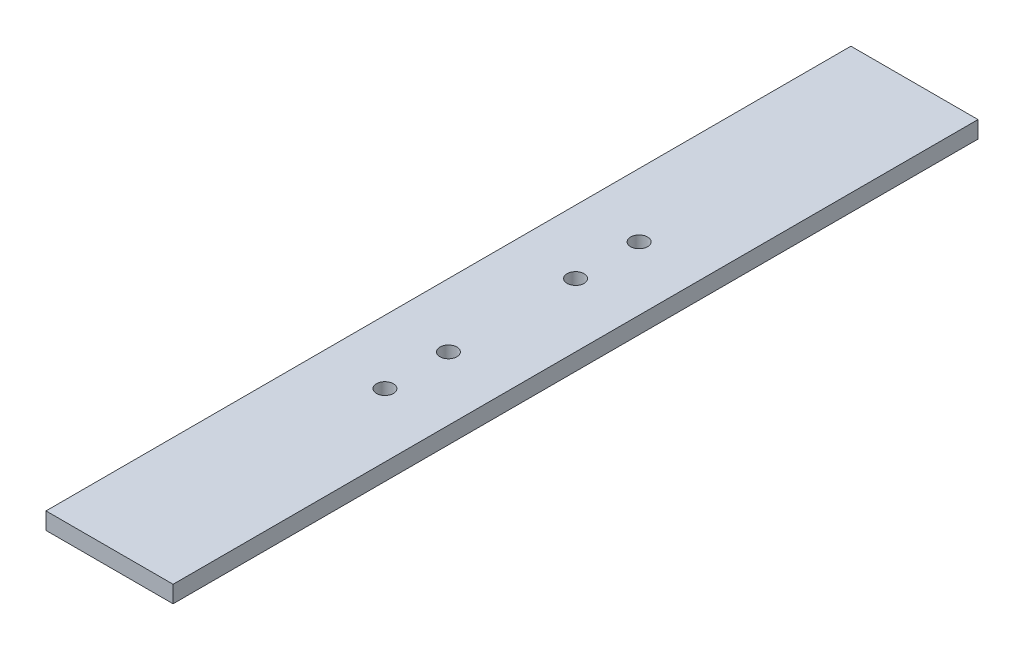
ISO-10303-21;
HEADER;
FILE_DESCRIPTION(('STEP AP214'),'2;1');
FILE_NAME('part.step','',(''),(''),'','','');
FILE_SCHEMA(('AUTOMOTIVE_DESIGN { 1 0 10303 214 1 1 1 1 }'));
ENDSEC;
DATA;
#1=APPLICATION_CONTEXT('core data for automotive mechanical design processes');
#2=APPLICATION_PROTOCOL_DEFINITION('international standard','automotive_design',2000,#1);
#3=PRODUCT_CONTEXT('',#1,'mechanical');
#4=PRODUCT('Part','Part','',(#3));
#5=PRODUCT_RELATED_PRODUCT_CATEGORY('part','',(#4));
#6=PRODUCT_DEFINITION_FORMATION('','',#4);
#7=PRODUCT_DEFINITION_CONTEXT('part definition',#1,'design');
#8=PRODUCT_DEFINITION('design','',#6,#7);
#9=PRODUCT_DEFINITION_SHAPE('','',#8);
#10=(LENGTH_UNIT() NAMED_UNIT(*) SI_UNIT(.MILLI.,.METRE.));
#11=(NAMED_UNIT(*) PLANE_ANGLE_UNIT() SI_UNIT($,.RADIAN.));
#12=(NAMED_UNIT(*) SI_UNIT($,.STERADIAN.) SOLID_ANGLE_UNIT());
#13=UNCERTAINTY_MEASURE_WITH_UNIT(LENGTH_MEASURE(1.E-05),#10,'distance_accuracy_value','');
#14=(GEOMETRIC_REPRESENTATION_CONTEXT(3) GLOBAL_UNCERTAINTY_ASSIGNED_CONTEXT((#13)) GLOBAL_UNIT_ASSIGNED_CONTEXT((#10,
#11,#12)) REPRESENTATION_CONTEXT('',''));
#15=CARTESIAN_POINT('',(0.,0.,0.));
#16=DIRECTION('',(0.,0.,1.));
#17=DIRECTION('',(1.,0.,0.));
#18=AXIS2_PLACEMENT_3D('',#15,#16,#17);
#19=CARTESIAN_POINT('',(0.,2.,0.));
#20=DIRECTION('',(0.,1.,0.));
#21=DIRECTION('',(0.,0.,1.));
#22=AXIS2_PLACEMENT_3D('',#19,#20,#21);
#23=PLANE('',#22);
#24=CARTESIAN_POINT('',(-57.5,2.,15.));
#25=DIRECTION('',(0.,1.,0.));
#26=DIRECTION('',(0.,0.,1.));
#27=AXIS2_PLACEMENT_3D('',#24,#25,#26);
#28=CIRCLE('',#27,0.999999999999998);
#29=CARTESIAN_POINT('',(-57.5,2.,16.));
#30=VERTEX_POINT('',#29);
#31=EDGE_CURVE('E142',#30,#30,#28,.T.);
#32=ORIENTED_EDGE('',*,*,#31,.F.);
#33=EDGE_LOOP('',(#32));
#34=FACE_BOUND('',#33,.T.);
#35=CARTESIAN_POINT('',(-57.5,2.,-15.));
#36=DIRECTION('',(0.,1.,0.));
#37=DIRECTION('',(0.,0.,1.));
#38=AXIS2_PLACEMENT_3D('',#35,#36,#37);
#39=CIRCLE('',#38,0.999999999999998);
#40=CARTESIAN_POINT('',(-57.5,2.,-14.));
#41=VERTEX_POINT('',#40);
#42=EDGE_CURVE('E112',#41,#41,#39,.T.);
#43=ORIENTED_EDGE('',*,*,#42,.F.);
#44=EDGE_LOOP('',(#43));
#45=FACE_BOUND('',#44,.T.);
#46=DIRECTION('',(0.,0.,1.));
#47=VECTOR('',#46,1.);
#48=CARTESIAN_POINT('',(-65.,2.,-47.5));
#49=LINE('',#48,#47);
#50=CARTESIAN_POINT('',(-65.,2.,-47.5));
#51=VERTEX_POINT('',#50);
#52=CARTESIAN_POINT('',(-65.,2.,47.5));
#53=VERTEX_POINT('',#52);
#54=EDGE_CURVE('E92',#51,#53,#49,.T.);
#55=ORIENTED_EDGE('',*,*,#54,.T.);
#56=DIRECTION('',(1.,0.,0.));
#57=VECTOR('',#56,1.);
#58=CARTESIAN_POINT('',(-65.,2.,47.5));
#59=LINE('',#58,#57);
#60=CARTESIAN_POINT('',(-50.,2.,47.5));
#61=VERTEX_POINT('',#60);
#62=EDGE_CURVE('E87',#53,#61,#59,.T.);
#63=ORIENTED_EDGE('',*,*,#62,.T.);
#64=DIRECTION('',(0.,0.,-1.));
#65=VECTOR('',#64,1.);
#66=CARTESIAN_POINT('',(-50.,2.,-47.5));
#67=LINE('',#66,#65);
#68=CARTESIAN_POINT('',(-50.,2.,-47.5));
#69=VERTEX_POINT('',#68);
#70=EDGE_CURVE('E90',#61,#69,#67,.T.);
#71=ORIENTED_EDGE('',*,*,#70,.T.);
#72=DIRECTION('',(-1.,0.,0.));
#73=VECTOR('',#72,1.);
#74=CARTESIAN_POINT('',(-65.,2.,-47.5));
#75=LINE('',#74,#73);
#76=EDGE_CURVE('E57',#69,#51,#75,.T.);
#77=ORIENTED_EDGE('',*,*,#76,.T.);
#78=EDGE_LOOP('',(#55,#63,#71,#77));
#79=FACE_BOUND('',#78,.T.);
#80=CARTESIAN_POINT('',(-57.5,2.,7.5));
#81=DIRECTION('',(0.,1.,0.));
#82=DIRECTION('',(0.,0.,1.));
#83=AXIS2_PLACEMENT_3D('',#80,#81,#82);
#84=CIRCLE('',#83,0.999999999999998);
#85=CARTESIAN_POINT('',(-57.5,2.,8.5));
#86=VERTEX_POINT('',#85);
#87=EDGE_CURVE('E134',#86,#86,#84,.T.);
#88=ORIENTED_EDGE('',*,*,#87,.F.);
#89=EDGE_LOOP('',(#88));
#90=FACE_BOUND('',#89,.T.);
#91=CARTESIAN_POINT('',(-57.5,2.,-7.5));
#92=DIRECTION('',(0.,1.,0.));
#93=DIRECTION('',(0.,0.,1.));
#94=AXIS2_PLACEMENT_3D('',#91,#92,#93);
#95=CIRCLE('',#94,0.999999999999998);
#96=CARTESIAN_POINT('',(-57.5,2.,-6.5));
#97=VERTEX_POINT('',#96);
#98=EDGE_CURVE('E150',#97,#97,#95,.T.);
#99=ORIENTED_EDGE('',*,*,#98,.F.);
#100=EDGE_LOOP('',(#99));
#101=FACE_BOUND('',#100,.T.);
#102=ADVANCED_FACE('F39',(#34,#45,#79,#90,#101),#23,.T.);
#103=CARTESIAN_POINT('',(0.,0.,0.));
#104=DIRECTION('',(0.,1.,0.));
#105=DIRECTION('',(0.,0.,1.));
#106=AXIS2_PLACEMENT_3D('',#103,#104,#105);
#107=PLANE('',#106);
#108=DIRECTION('',(0.,0.,1.));
#109=VECTOR('',#108,1.);
#110=CARTESIAN_POINT('',(-65.,0.,-47.5));
#111=LINE('',#110,#109);
#112=CARTESIAN_POINT('',(-65.,0.,-47.5));
#113=VERTEX_POINT('',#112);
#114=CARTESIAN_POINT('',(-65.,0.,47.5));
#115=VERTEX_POINT('',#114);
#116=EDGE_CURVE('E108',#113,#115,#111,.T.);
#117=ORIENTED_EDGE('',*,*,#116,.F.);
#118=DIRECTION('',(-1.,0.,0.));
#119=VECTOR('',#118,1.);
#120=CARTESIAN_POINT('',(-65.,0.,-47.5));
#121=LINE('',#120,#119);
#122=CARTESIAN_POINT('',(-50.,0.,-47.5));
#123=VERTEX_POINT('',#122);
#124=EDGE_CURVE('E80',#123,#113,#121,.T.);
#125=ORIENTED_EDGE('',*,*,#124,.F.);
#126=DIRECTION('',(0.,0.,-1.));
#127=VECTOR('',#126,1.);
#128=CARTESIAN_POINT('',(-50.,0.,-47.5));
#129=LINE('',#128,#127);
#130=CARTESIAN_POINT('',(-50.,0.,47.5));
#131=VERTEX_POINT('',#130);
#132=EDGE_CURVE('E74',#131,#123,#129,.T.);
#133=ORIENTED_EDGE('',*,*,#132,.F.);
#134=DIRECTION('',(1.,0.,0.));
#135=VECTOR('',#134,1.);
#136=CARTESIAN_POINT('',(-65.,0.,47.5));
#137=LINE('',#136,#135);
#138=EDGE_CURVE('E97',#115,#131,#137,.T.);
#139=ORIENTED_EDGE('',*,*,#138,.F.);
#140=EDGE_LOOP('',(#117,#125,#133,#139));
#141=FACE_BOUND('',#140,.T.);
#142=CARTESIAN_POINT('',(-57.5,0.,-15.));
#143=DIRECTION('',(0.,1.,0.));
#144=DIRECTION('',(0.,0.,1.));
#145=AXIS2_PLACEMENT_3D('',#142,#143,#144);
#146=CIRCLE('',#145,0.999999999999998);
#147=CARTESIAN_POINT('',(-57.5,0.,-14.));
#148=VERTEX_POINT('',#147);
#149=EDGE_CURVE('E130',#148,#148,#146,.T.);
#150=ORIENTED_EDGE('',*,*,#149,.T.);
#151=EDGE_LOOP('',(#150));
#152=FACE_BOUND('',#151,.T.);
#153=CARTESIAN_POINT('',(-57.5,0.,7.5));
#154=DIRECTION('',(0.,1.,0.));
#155=DIRECTION('',(0.,0.,1.));
#156=AXIS2_PLACEMENT_3D('',#153,#154,#155);
#157=CIRCLE('',#156,0.999999999999998);
#158=CARTESIAN_POINT('',(-57.5,0.,8.5));
#159=VERTEX_POINT('',#158);
#160=EDGE_CURVE('E138',#159,#159,#157,.T.);
#161=ORIENTED_EDGE('',*,*,#160,.T.);
#162=EDGE_LOOP('',(#161));
#163=FACE_BOUND('',#162,.T.);
#164=CARTESIAN_POINT('',(-57.5,0.,15.));
#165=DIRECTION('',(0.,1.,0.));
#166=DIRECTION('',(0.,0.,1.));
#167=AXIS2_PLACEMENT_3D('',#164,#165,#166);
#168=CIRCLE('',#167,0.999999999999998);
#169=CARTESIAN_POINT('',(-57.5,0.,16.));
#170=VERTEX_POINT('',#169);
#171=EDGE_CURVE('E146',#170,#170,#168,.T.);
#172=ORIENTED_EDGE('',*,*,#171,.T.);
#173=EDGE_LOOP('',(#172));
#174=FACE_BOUND('',#173,.T.);
#175=CARTESIAN_POINT('',(-57.5,0.,-7.5));
#176=DIRECTION('',(0.,1.,0.));
#177=DIRECTION('',(0.,0.,1.));
#178=AXIS2_PLACEMENT_3D('',#175,#176,#177);
#179=CIRCLE('',#178,0.999999999999998);
#180=CARTESIAN_POINT('',(-57.5,0.,-6.5));
#181=VERTEX_POINT('',#180);
#182=EDGE_CURVE('E154',#181,#181,#179,.T.);
#183=ORIENTED_EDGE('',*,*,#182,.T.);
#184=EDGE_LOOP('',(#183));
#185=FACE_BOUND('',#184,.T.);
#186=ADVANCED_FACE('F125',(#141,#152,#163,#174,#185),#107,.F.);
#187=CARTESIAN_POINT('',(-65.,2.,-47.5));
#188=DIRECTION('',(1.,0.,0.));
#189=DIRECTION('',(0.,0.,-1.));
#190=AXIS2_PLACEMENT_3D('',#187,#188,#189);
#191=PLANE('',#190);
#192=ORIENTED_EDGE('',*,*,#116,.T.);
#193=DIRECTION('',(0.,-1.,0.));
#194=VECTOR('',#193,1.);
#195=CARTESIAN_POINT('',(-65.,2.,47.5));
#196=LINE('',#195,#194);
#197=EDGE_CURVE('E11',#53,#115,#196,.T.);
#198=ORIENTED_EDGE('',*,*,#197,.F.);
#199=ORIENTED_EDGE('',*,*,#54,.F.);
#200=DIRECTION('',(0.,-1.,0.));
#201=VECTOR('',#200,1.);
#202=CARTESIAN_POINT('',(-65.,2.,-47.5));
#203=LINE('',#202,#201);
#204=EDGE_CURVE('E104',#51,#113,#203,.T.);
#205=ORIENTED_EDGE('',*,*,#204,.T.);
#206=EDGE_LOOP('',(#192,#198,#199,#205));
#207=FACE_BOUND('',#206,.T.);
#208=ADVANCED_FACE('F41',(#207),#191,.F.);
#209=CARTESIAN_POINT('',(-65.,2.,47.5));
#210=DIRECTION('',(0.,0.,-1.));
#211=DIRECTION('',(-1.,0.,0.));
#212=AXIS2_PLACEMENT_3D('',#209,#210,#211);
#213=PLANE('',#212);
#214=ORIENTED_EDGE('',*,*,#138,.T.);
#215=DIRECTION('',(0.,-1.,0.));
#216=VECTOR('',#215,1.);
#217=CARTESIAN_POINT('',(-50.,2.,47.5));
#218=LINE('',#217,#216);
#219=EDGE_CURVE('E49',#61,#131,#218,.T.);
#220=ORIENTED_EDGE('',*,*,#219,.F.);
#221=ORIENTED_EDGE('',*,*,#62,.F.);
#222=ORIENTED_EDGE('',*,*,#197,.T.);
#223=EDGE_LOOP('',(#214,#220,#221,#222));
#224=FACE_BOUND('',#223,.T.);
#225=ADVANCED_FACE('F96',(#224),#213,.F.);
#226=CARTESIAN_POINT('',(-50.,2.,-47.5));
#227=DIRECTION('',(-1.,0.,0.));
#228=DIRECTION('',(0.,0.,1.));
#229=AXIS2_PLACEMENT_3D('',#226,#227,#228);
#230=PLANE('',#229);
#231=ORIENTED_EDGE('',*,*,#132,.T.);
#232=DIRECTION('',(0.,-1.,0.));
#233=VECTOR('',#232,1.);
#234=CARTESIAN_POINT('',(-50.,2.,-47.5));
#235=LINE('',#234,#233);
#236=EDGE_CURVE('E99',#69,#123,#235,.T.);
#237=ORIENTED_EDGE('',*,*,#236,.F.);
#238=ORIENTED_EDGE('',*,*,#70,.F.);
#239=ORIENTED_EDGE('',*,*,#219,.T.);
#240=EDGE_LOOP('',(#231,#237,#238,#239));
#241=FACE_BOUND('',#240,.T.);
#242=ADVANCED_FACE('F100',(#241),#230,.F.);
#243=CARTESIAN_POINT('',(-65.,2.,-47.5));
#244=DIRECTION('',(0.,0.,1.));
#245=DIRECTION('',(1.,0.,0.));
#246=AXIS2_PLACEMENT_3D('',#243,#244,#245);
#247=PLANE('',#246);
#248=ORIENTED_EDGE('',*,*,#124,.T.);
#249=ORIENTED_EDGE('',*,*,#204,.F.);
#250=ORIENTED_EDGE('',*,*,#76,.F.);
#251=ORIENTED_EDGE('',*,*,#236,.T.);
#252=EDGE_LOOP('',(#248,#249,#250,#251));
#253=FACE_BOUND('',#252,.T.);
#254=ADVANCED_FACE('F122',(#253),#247,.F.);
#255=CARTESIAN_POINT('',(-57.5,2.,-15.));
#256=DIRECTION('',(0.,-1.,0.));
#257=DIRECTION('',(0.,0.,-1.));
#258=AXIS2_PLACEMENT_3D('',#255,#256,#257);
#259=CYLINDRICAL_SURFACE('',#258,0.999999999999998);
#260=ORIENTED_EDGE('',*,*,#42,.T.);
#261=EDGE_LOOP('',(#260));
#262=FACE_BOUND('',#261,.T.);
#263=ORIENTED_EDGE('',*,*,#149,.F.);
#264=EDGE_LOOP('',(#263));
#265=FACE_BOUND('',#264,.T.);
#266=ADVANCED_FACE('F175',(#262,#265),#259,.F.);
#267=CARTESIAN_POINT('',(-57.5,2.,7.5));
#268=DIRECTION('',(0.,-1.,0.));
#269=DIRECTION('',(0.,0.,-1.));
#270=AXIS2_PLACEMENT_3D('',#267,#268,#269);
#271=CYLINDRICAL_SURFACE('',#270,0.999999999999998);
#272=ORIENTED_EDGE('',*,*,#87,.T.);
#273=EDGE_LOOP('',(#272));
#274=FACE_BOUND('',#273,.T.);
#275=ORIENTED_EDGE('',*,*,#160,.F.);
#276=EDGE_LOOP('',(#275));
#277=FACE_BOUND('',#276,.T.);
#278=ADVANCED_FACE('F221',(#274,#277),#271,.F.);
#279=CARTESIAN_POINT('',(-57.5,2.,15.));
#280=DIRECTION('',(0.,-1.,0.));
#281=DIRECTION('',(0.,0.,-1.));
#282=AXIS2_PLACEMENT_3D('',#279,#280,#281);
#283=CYLINDRICAL_SURFACE('',#282,0.999999999999998);
#284=ORIENTED_EDGE('',*,*,#31,.T.);
#285=EDGE_LOOP('',(#284));
#286=FACE_BOUND('',#285,.T.);
#287=ORIENTED_EDGE('',*,*,#171,.F.);
#288=EDGE_LOOP('',(#287));
#289=FACE_BOUND('',#288,.T.);
#290=ADVANCED_FACE('F229',(#286,#289),#283,.F.);
#291=CARTESIAN_POINT('',(-57.5,2.,-7.5));
#292=DIRECTION('',(0.,-1.,0.));
#293=DIRECTION('',(0.,0.,-1.));
#294=AXIS2_PLACEMENT_3D('',#291,#292,#293);
#295=CYLINDRICAL_SURFACE('',#294,0.999999999999998);
#296=ORIENTED_EDGE('',*,*,#98,.T.);
#297=EDGE_LOOP('',(#296));
#298=FACE_BOUND('',#297,.T.);
#299=ORIENTED_EDGE('',*,*,#182,.F.);
#300=EDGE_LOOP('',(#299));
#301=FACE_BOUND('',#300,.T.);
#302=ADVANCED_FACE('F162',(#298,#301),#295,.F.);
#303=CLOSED_SHELL('',(#102,#186,#208,#225,#242,#254,#266,#278,#290,#302));
#304=MANIFOLD_SOLID_BREP('B2',#303);
#305=ADVANCED_BREP_SHAPE_REPRESENTATION('',(#18,#304),#14);
#306=SHAPE_DEFINITION_REPRESENTATION(#9,#305);
ENDSEC;
END-ISO-10303-21;
